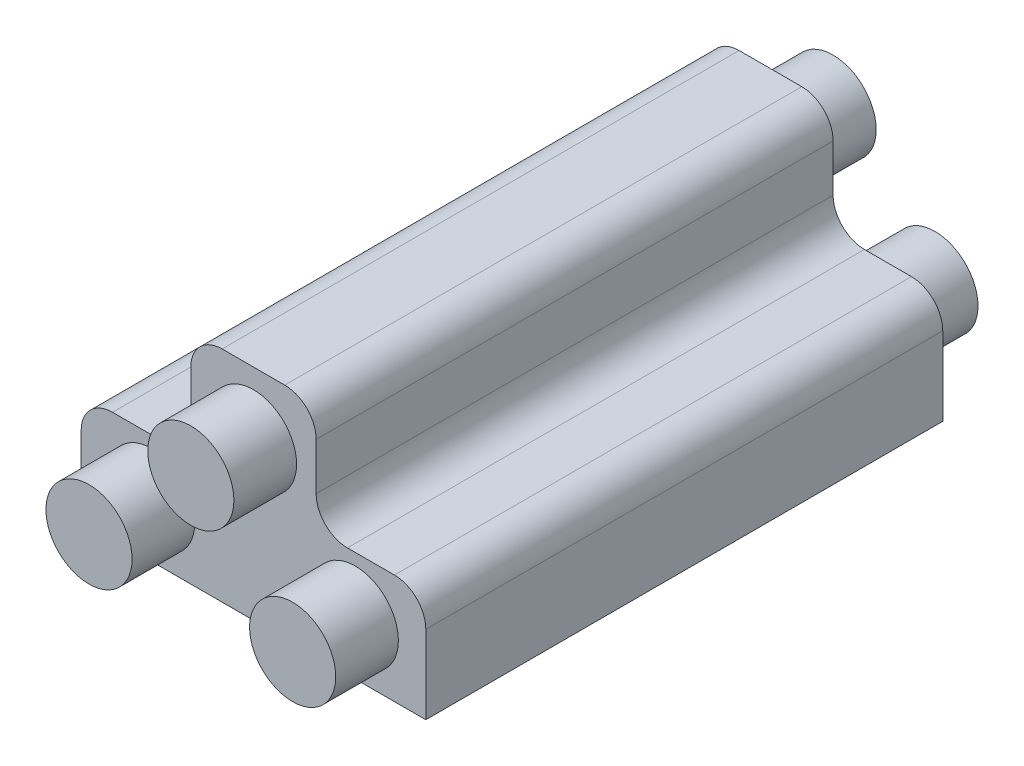
ISO-10303-21;
HEADER;
FILE_DESCRIPTION(('STEP AP214'),'2;1');
FILE_NAME('part.step','',(''),(''),'','','');
FILE_SCHEMA(('AUTOMOTIVE_DESIGN { 1 0 10303 214 1 1 1 1 }'));
ENDSEC;
DATA;
#1=APPLICATION_CONTEXT('core data for automotive mechanical design processes');
#2=APPLICATION_PROTOCOL_DEFINITION('international standard','automotive_design',2000,#1);
#3=PRODUCT_CONTEXT('',#1,'mechanical');
#4=PRODUCT('Part','Part','',(#3));
#5=PRODUCT_RELATED_PRODUCT_CATEGORY('part','',(#4));
#6=PRODUCT_DEFINITION_FORMATION('','',#4);
#7=PRODUCT_DEFINITION_CONTEXT('part definition',#1,'design');
#8=PRODUCT_DEFINITION('design','',#6,#7);
#9=PRODUCT_DEFINITION_SHAPE('','',#8);
#10=(LENGTH_UNIT() NAMED_UNIT(*) SI_UNIT(.MILLI.,.METRE.));
#11=(NAMED_UNIT(*) PLANE_ANGLE_UNIT() SI_UNIT($,.RADIAN.));
#12=(NAMED_UNIT(*) SI_UNIT($,.STERADIAN.) SOLID_ANGLE_UNIT());
#13=UNCERTAINTY_MEASURE_WITH_UNIT(LENGTH_MEASURE(1.E-05),#10,'distance_accuracy_value','');
#14=(GEOMETRIC_REPRESENTATION_CONTEXT(3) GLOBAL_UNCERTAINTY_ASSIGNED_CONTEXT((#13)) GLOBAL_UNIT_ASSIGNED_CONTEXT((#10,
#11,#12)) REPRESENTATION_CONTEXT('',''));
#15=CARTESIAN_POINT('',(0.,0.,0.));
#16=DIRECTION('',(0.,0.,1.));
#17=DIRECTION('',(1.,0.,0.));
#18=AXIS2_PLACEMENT_3D('',#15,#16,#17);
#19=CARTESIAN_POINT('',(5.5,1.75,16.5));
#20=DIRECTION('',(-1.,0.,0.));
#21=DIRECTION('',(0.,-1.,0.));
#22=AXIS2_PLACEMENT_3D('',#19,#20,#21);
#23=PLANE('',#22);
#24=DIRECTION('',(0.,1.,0.));
#25=VECTOR('',#24,1.);
#26=CARTESIAN_POINT('',(5.5,1.75,0.));
#27=LINE('',#26,#25);
#28=CARTESIAN_POINT('',(5.5,-1.75,0.));
#29=VERTEX_POINT('',#28);
#30=CARTESIAN_POINT('',(5.5,0.749999999999998,0.));
#31=VERTEX_POINT('',#30);
#32=EDGE_CURVE('E168',#29,#31,#27,.T.);
#33=ORIENTED_EDGE('',*,*,#32,.T.);
#34=DIRECTION('',(0.,0.,-1.));
#35=VECTOR('',#34,1.);
#36=CARTESIAN_POINT('',(5.5,0.749999999999998,16.5));
#37=LINE('',#36,#35);
#38=CARTESIAN_POINT('',(5.5,0.749999999999998,16.5));
#39=VERTEX_POINT('',#38);
#40=EDGE_CURVE('E215',#31,#39,#37,.F.);
#41=ORIENTED_EDGE('',*,*,#40,.T.);
#42=DIRECTION('',(0.,1.,0.));
#43=VECTOR('',#42,1.);
#44=CARTESIAN_POINT('',(5.5,1.75,16.5));
#45=LINE('',#44,#43);
#46=CARTESIAN_POINT('',(5.5,-1.75,16.5));
#47=VERTEX_POINT('',#46);
#48=EDGE_CURVE('E186',#47,#39,#45,.T.);
#49=ORIENTED_EDGE('',*,*,#48,.F.);
#50=DIRECTION('',(0.,0.,-1.));
#51=VECTOR('',#50,1.);
#52=CARTESIAN_POINT('',(5.5,-1.75,16.5));
#53=LINE('',#52,#51);
#54=EDGE_CURVE('E159',#47,#29,#53,.T.);
#55=ORIENTED_EDGE('',*,*,#54,.T.);
#56=EDGE_LOOP('',(#33,#41,#49,#55));
#57=FACE_BOUND('',#56,.T.);
#58=ADVANCED_FACE('F37',(#57),#23,.F.);
#59=CARTESIAN_POINT('',(2.,1.75,16.5));
#60=DIRECTION('',(0.,-1.,0.));
#61=DIRECTION('',(1.,0.,0.));
#62=AXIS2_PLACEMENT_3D('',#59,#60,#61);
#63=PLANE('',#62);
#64=DIRECTION('',(-1.,0.,0.));
#65=VECTOR('',#64,1.);
#66=CARTESIAN_POINT('',(2.,1.75,0.));
#67=LINE('',#66,#65);
#68=CARTESIAN_POINT('',(4.5,1.75,0.));
#69=VERTEX_POINT('',#68);
#70=CARTESIAN_POINT('',(3.,1.75,0.));
#71=VERTEX_POINT('',#70);
#72=EDGE_CURVE('E171',#69,#71,#67,.T.);
#73=ORIENTED_EDGE('',*,*,#72,.T.);
#74=DIRECTION('',(0.,0.,-1.));
#75=VECTOR('',#74,1.);
#76=CARTESIAN_POINT('',(3.,1.75,16.5));
#77=LINE('',#76,#75);
#78=CARTESIAN_POINT('',(3.,1.75,16.5));
#79=VERTEX_POINT('',#78);
#80=EDGE_CURVE('E58',#71,#79,#77,.F.);
#81=ORIENTED_EDGE('',*,*,#80,.T.);
#82=DIRECTION('',(-1.,0.,0.));
#83=VECTOR('',#82,1.);
#84=CARTESIAN_POINT('',(2.,1.75,16.5));
#85=LINE('',#84,#83);
#86=CARTESIAN_POINT('',(4.5,1.75,16.5));
#87=VERTEX_POINT('',#86);
#88=EDGE_CURVE('E292',#87,#79,#85,.T.);
#89=ORIENTED_EDGE('',*,*,#88,.F.);
#90=DIRECTION('',(0.,0.,-1.));
#91=VECTOR('',#90,1.);
#92=CARTESIAN_POINT('',(4.5,1.75,16.5));
#93=LINE('',#92,#91);
#94=EDGE_CURVE('E201',#87,#69,#93,.T.);
#95=ORIENTED_EDGE('',*,*,#94,.T.);
#96=EDGE_LOOP('',(#73,#81,#89,#95));
#97=FACE_BOUND('',#96,.T.);
#98=ADVANCED_FACE('F340',(#97),#63,.F.);
#99=CARTESIAN_POINT('',(2.,5.25,16.5));
#100=DIRECTION('',(-1.,0.,0.));
#101=DIRECTION('',(0.,-1.,0.));
#102=AXIS2_PLACEMENT_3D('',#99,#100,#101);
#103=PLANE('',#102);
#104=DIRECTION('',(0.,1.,0.));
#105=VECTOR('',#104,1.);
#106=CARTESIAN_POINT('',(2.,5.25,16.5));
#107=LINE('',#106,#105);
#108=CARTESIAN_POINT('',(2.,2.75,16.5));
#109=VERTEX_POINT('',#108);
#110=CARTESIAN_POINT('',(2.,4.25,16.5));
#111=VERTEX_POINT('',#110);
#112=EDGE_CURVE('E289',#109,#111,#107,.T.);
#113=ORIENTED_EDGE('',*,*,#112,.F.);
#114=DIRECTION('',(0.,0.,-1.));
#115=VECTOR('',#114,1.);
#116=CARTESIAN_POINT('',(2.,2.75,0.));
#117=LINE('',#116,#115);
#118=CARTESIAN_POINT('',(2.,2.75,0.));
#119=VERTEX_POINT('',#118);
#120=EDGE_CURVE('E245',#109,#119,#117,.T.);
#121=ORIENTED_EDGE('',*,*,#120,.T.);
#122=DIRECTION('',(0.,1.,0.));
#123=VECTOR('',#122,1.);
#124=CARTESIAN_POINT('',(2.,5.25,0.));
#125=LINE('',#124,#123);
#126=CARTESIAN_POINT('',(2.,4.25,0.));
#127=VERTEX_POINT('',#126);
#128=EDGE_CURVE('E174',#119,#127,#125,.T.);
#129=ORIENTED_EDGE('',*,*,#128,.T.);
#130=DIRECTION('',(0.,0.,-1.));
#131=VECTOR('',#130,1.);
#132=CARTESIAN_POINT('',(2.,4.25,16.5));
#133=LINE('',#132,#131);
#134=EDGE_CURVE('E229',#127,#111,#133,.F.);
#135=ORIENTED_EDGE('',*,*,#134,.T.);
#136=EDGE_LOOP('',(#113,#121,#129,#135));
#137=FACE_BOUND('',#136,.T.);
#138=ADVANCED_FACE('F287',(#137),#103,.F.);
#139=CARTESIAN_POINT('',(-2.,5.25,16.5));
#140=DIRECTION('',(0.,-1.,0.));
#141=DIRECTION('',(1.,0.,0.));
#142=AXIS2_PLACEMENT_3D('',#139,#140,#141);
#143=PLANE('',#142);
#144=DIRECTION('',(-1.,0.,0.));
#145=VECTOR('',#144,1.);
#146=CARTESIAN_POINT('',(-2.,5.25,16.5));
#147=LINE('',#146,#145);
#148=CARTESIAN_POINT('',(1.,5.25,16.5));
#149=VERTEX_POINT('',#148);
#150=CARTESIAN_POINT('',(-0.999999999999999,5.25,16.5));
#151=VERTEX_POINT('',#150);
#152=EDGE_CURVE('E280',#149,#151,#147,.T.);
#153=ORIENTED_EDGE('',*,*,#152,.F.);
#154=DIRECTION('',(0.,0.,-1.));
#155=VECTOR('',#154,1.);
#156=CARTESIAN_POINT('',(1.,5.25,16.5));
#157=LINE('',#156,#155);
#158=CARTESIAN_POINT('',(1.,5.25,0.));
#159=VERTEX_POINT('',#158);
#160=EDGE_CURVE('E226',#149,#159,#157,.T.);
#161=ORIENTED_EDGE('',*,*,#160,.T.);
#162=DIRECTION('',(-1.,0.,0.));
#163=VECTOR('',#162,1.);
#164=CARTESIAN_POINT('',(-2.,5.25,0.));
#165=LINE('',#164,#163);
#166=CARTESIAN_POINT('',(-0.999999999999999,5.25,0.));
#167=VERTEX_POINT('',#166);
#168=EDGE_CURVE('E176',#159,#167,#165,.T.);
#169=ORIENTED_EDGE('',*,*,#168,.T.);
#170=DIRECTION('',(0.,0.,-1.));
#171=VECTOR('',#170,1.);
#172=CARTESIAN_POINT('',(-0.999999999999999,5.25,16.5));
#173=LINE('',#172,#171);
#174=EDGE_CURVE('E224',#167,#151,#173,.F.);
#175=ORIENTED_EDGE('',*,*,#174,.T.);
#176=EDGE_LOOP('',(#153,#161,#169,#175));
#177=FACE_BOUND('',#176,.T.);
#178=ADVANCED_FACE('F277',(#177),#143,.F.);
#179=CARTESIAN_POINT('',(-2.,1.75,16.5));
#180=DIRECTION('',(1.,0.,0.));
#181=DIRECTION('',(0.,1.,0.));
#182=AXIS2_PLACEMENT_3D('',#179,#180,#181);
#183=PLANE('',#182);
#184=DIRECTION('',(0.,-1.,0.));
#185=VECTOR('',#184,1.);
#186=CARTESIAN_POINT('',(-2.,1.75,0.));
#187=LINE('',#186,#185);
#188=CARTESIAN_POINT('',(-2.,4.25,0.));
#189=VERTEX_POINT('',#188);
#190=CARTESIAN_POINT('',(-2.,2.75,0.));
#191=VERTEX_POINT('',#190);
#192=EDGE_CURVE('E179',#189,#191,#187,.T.);
#193=ORIENTED_EDGE('',*,*,#192,.T.);
#194=DIRECTION('',(0.,0.,-1.));
#195=VECTOR('',#194,1.);
#196=CARTESIAN_POINT('',(-2.,2.75,16.5));
#197=LINE('',#196,#195);
#198=CARTESIAN_POINT('',(-2.,2.75,16.5));
#199=VERTEX_POINT('',#198);
#200=EDGE_CURVE('E243',#191,#199,#197,.F.);
#201=ORIENTED_EDGE('',*,*,#200,.T.);
#202=DIRECTION('',(0.,-1.,0.));
#203=VECTOR('',#202,1.);
#204=CARTESIAN_POINT('',(-2.,1.75,16.5));
#205=LINE('',#204,#203);
#206=CARTESIAN_POINT('',(-2.,4.25,16.5));
#207=VERTEX_POINT('',#206);
#208=EDGE_CURVE('E256',#207,#199,#205,.T.);
#209=ORIENTED_EDGE('',*,*,#208,.F.);
#210=DIRECTION('',(0.,0.,-1.));
#211=VECTOR('',#210,1.);
#212=CARTESIAN_POINT('',(-2.,4.25,16.5));
#213=LINE('',#212,#211);
#214=EDGE_CURVE('E232',#207,#189,#213,.T.);
#215=ORIENTED_EDGE('',*,*,#214,.T.);
#216=EDGE_LOOP('',(#193,#201,#209,#215));
#217=FACE_BOUND('',#216,.T.);
#218=ADVANCED_FACE('F268',(#217),#183,.F.);
#219=CARTESIAN_POINT('',(-5.5,1.75,16.5));
#220=DIRECTION('',(0.,-1.,0.));
#221=DIRECTION('',(1.,0.,0.));
#222=AXIS2_PLACEMENT_3D('',#219,#220,#221);
#223=PLANE('',#222);
#224=DIRECTION('',(-1.,0.,0.));
#225=VECTOR('',#224,1.);
#226=CARTESIAN_POINT('',(-5.5,1.75,16.5));
#227=LINE('',#226,#225);
#228=CARTESIAN_POINT('',(-3.,1.75,16.5));
#229=VERTEX_POINT('',#228);
#230=CARTESIAN_POINT('',(-4.5,1.75,16.5));
#231=VERTEX_POINT('',#230);
#232=EDGE_CURVE('E149',#229,#231,#227,.T.);
#233=ORIENTED_EDGE('',*,*,#232,.F.);
#234=DIRECTION('',(0.,0.,-1.));
#235=VECTOR('',#234,1.);
#236=CARTESIAN_POINT('',(-3.,1.75,0.));
#237=LINE('',#236,#235);
#238=CARTESIAN_POINT('',(-3.,1.75,0.));
#239=VERTEX_POINT('',#238);
#240=EDGE_CURVE('E240',#229,#239,#237,.T.);
#241=ORIENTED_EDGE('',*,*,#240,.T.);
#242=DIRECTION('',(-1.,0.,0.));
#243=VECTOR('',#242,1.);
#244=CARTESIAN_POINT('',(-5.5,1.75,0.));
#245=LINE('',#244,#243);
#246=CARTESIAN_POINT('',(-4.5,1.75,0.));
#247=VERTEX_POINT('',#246);
#248=EDGE_CURVE('E182',#239,#247,#245,.T.);
#249=ORIENTED_EDGE('',*,*,#248,.T.);
#250=DIRECTION('',(0.,0.,-1.));
#251=VECTOR('',#250,1.);
#252=CARTESIAN_POINT('',(-4.5,1.75,16.5));
#253=LINE('',#252,#251);
#254=EDGE_CURVE('E237',#247,#231,#253,.F.);
#255=ORIENTED_EDGE('',*,*,#254,.T.);
#256=EDGE_LOOP('',(#233,#241,#249,#255));
#257=FACE_BOUND('',#256,.T.);
#258=ADVANCED_FACE('F261',(#257),#223,.F.);
#259=CARTESIAN_POINT('',(-5.5,1.75,16.5));
#260=DIRECTION('',(1.,0.,0.));
#261=DIRECTION('',(0.,1.,0.));
#262=AXIS2_PLACEMENT_3D('',#259,#260,#261);
#263=PLANE('',#262);
#264=DIRECTION('',(0.,-1.,0.));
#265=VECTOR('',#264,1.);
#266=CARTESIAN_POINT('',(-5.5,1.75,16.5));
#267=LINE('',#266,#265);
#268=CARTESIAN_POINT('',(-5.5,0.75,16.5));
#269=VERTEX_POINT('',#268);
#270=CARTESIAN_POINT('',(-5.5,-1.75,16.5));
#271=VERTEX_POINT('',#270);
#272=EDGE_CURVE('E137',#269,#271,#267,.T.);
#273=ORIENTED_EDGE('',*,*,#272,.F.);
#274=DIRECTION('',(0.,0.,-1.));
#275=VECTOR('',#274,1.);
#276=CARTESIAN_POINT('',(-5.5,0.75,16.5));
#277=LINE('',#276,#275);
#278=CARTESIAN_POINT('',(-5.5,0.75,0.));
#279=VERTEX_POINT('',#278);
#280=EDGE_CURVE('E235',#269,#279,#277,.T.);
#281=ORIENTED_EDGE('',*,*,#280,.T.);
#282=DIRECTION('',(0.,-1.,0.));
#283=VECTOR('',#282,1.);
#284=CARTESIAN_POINT('',(-5.5,1.75,0.));
#285=LINE('',#284,#283);
#286=CARTESIAN_POINT('',(-5.5,-1.75,0.));
#287=VERTEX_POINT('',#286);
#288=EDGE_CURVE('E155',#279,#287,#285,.T.);
#289=ORIENTED_EDGE('',*,*,#288,.T.);
#290=DIRECTION('',(0.,0.,-1.));
#291=VECTOR('',#290,1.);
#292=CARTESIAN_POINT('',(-5.5,-1.75,16.5));
#293=LINE('',#292,#291);
#294=EDGE_CURVE('E152',#271,#287,#293,.T.);
#295=ORIENTED_EDGE('',*,*,#294,.F.);
#296=EDGE_LOOP('',(#273,#281,#289,#295));
#297=FACE_BOUND('',#296,.T.);
#298=ADVANCED_FACE('F153',(#297),#263,.F.);
#299=CARTESIAN_POINT('',(-5.5,-1.75,16.5));
#300=DIRECTION('',(0.,1.,0.));
#301=DIRECTION('',(-1.,0.,0.));
#302=AXIS2_PLACEMENT_3D('',#299,#300,#301);
#303=PLANE('',#302);
#304=DIRECTION('',(1.,0.,0.));
#305=VECTOR('',#304,1.);
#306=CARTESIAN_POINT('',(-5.5,-1.75,0.));
#307=LINE('',#306,#305);
#308=EDGE_CURVE('E185',#287,#29,#307,.T.);
#309=ORIENTED_EDGE('',*,*,#308,.T.);
#310=ORIENTED_EDGE('',*,*,#54,.F.);
#311=DIRECTION('',(1.,0.,0.));
#312=VECTOR('',#311,1.);
#313=CARTESIAN_POINT('',(-5.5,-1.75,16.5));
#314=LINE('',#313,#312);
#315=EDGE_CURVE('E142',#271,#47,#314,.T.);
#316=ORIENTED_EDGE('',*,*,#315,.F.);
#317=ORIENTED_EDGE('',*,*,#294,.T.);
#318=EDGE_LOOP('',(#309,#310,#316,#317));
#319=FACE_BOUND('',#318,.T.);
#320=ADVANCED_FACE('F161',(#319),#303,.F.);
#321=CARTESIAN_POINT('',(0.,0.,16.5));
#322=DIRECTION('',(0.,0.,1.));
#323=DIRECTION('',(1.,0.,0.));
#324=AXIS2_PLACEMENT_3D('',#321,#322,#323);
#325=PLANE('',#324);
#326=CARTESIAN_POINT('',(3.25,0.,16.5));
#327=DIRECTION('',(0.,0.,1.));
#328=DIRECTION('',(1.,0.,0.));
#329=AXIS2_PLACEMENT_3D('',#326,#327,#328);
#330=CIRCLE('',#329,1.375);
#331=CARTESIAN_POINT('',(4.625,0.,16.5));
#332=VERTEX_POINT('',#331);
#333=EDGE_CURVE('E205',#332,#332,#330,.T.);
#334=ORIENTED_EDGE('',*,*,#333,.F.);
#335=EDGE_LOOP('',(#334));
#336=FACE_BOUND('',#335,.T.);
#337=CARTESIAN_POINT('',(-3.25,0.,16.5));
#338=DIRECTION('',(0.,0.,1.));
#339=DIRECTION('',(1.,0.,0.));
#340=AXIS2_PLACEMENT_3D('',#337,#338,#339);
#341=CIRCLE('',#340,1.375);
#342=CARTESIAN_POINT('',(-1.875,0.,16.5));
#343=VERTEX_POINT('',#342);
#344=EDGE_CURVE('E303',#343,#343,#341,.T.);
#345=ORIENTED_EDGE('',*,*,#344,.F.);
#346=EDGE_LOOP('',(#345));
#347=FACE_BOUND('',#346,.T.);
#348=CARTESIAN_POINT('',(0.,3.25,16.5));
#349=DIRECTION('',(0.,0.,1.));
#350=DIRECTION('',(1.,0.,0.));
#351=AXIS2_PLACEMENT_3D('',#348,#349,#350);
#352=CIRCLE('',#351,1.375);
#353=CARTESIAN_POINT('',(1.375,3.25,16.5));
#354=VERTEX_POINT('',#353);
#355=EDGE_CURVE('E158',#354,#354,#352,.T.);
#356=ORIENTED_EDGE('',*,*,#355,.F.);
#357=EDGE_LOOP('',(#356));
#358=FACE_BOUND('',#357,.T.);
#359=ORIENTED_EDGE('',*,*,#48,.T.);
#360=CARTESIAN_POINT('',(4.5,0.749999999999998,16.5));
#361=DIRECTION('',(0.,0.,1.));
#362=DIRECTION('',(1.,0.,0.));
#363=AXIS2_PLACEMENT_3D('',#360,#361,#362);
#364=CIRCLE('',#363,1.);
#365=EDGE_CURVE('E222',#39,#87,#364,.T.);
#366=ORIENTED_EDGE('',*,*,#365,.T.);
#367=ORIENTED_EDGE('',*,*,#88,.T.);
#368=CARTESIAN_POINT('',(3.,2.75,16.5));
#369=DIRECTION('',(0.,0.,1.));
#370=DIRECTION('',(1.,0.,0.));
#371=AXIS2_PLACEMENT_3D('',#368,#369,#370);
#372=CIRCLE('',#371,1.);
#373=EDGE_CURVE('E11',#79,#109,#372,.F.);
#374=ORIENTED_EDGE('',*,*,#373,.T.);
#375=ORIENTED_EDGE('',*,*,#112,.T.);
#376=CARTESIAN_POINT('',(1.,4.25,16.5));
#377=DIRECTION('',(0.,0.,1.));
#378=DIRECTION('',(1.,0.,0.));
#379=AXIS2_PLACEMENT_3D('',#376,#377,#378);
#380=CIRCLE('',#379,1.);
#381=EDGE_CURVE('E220',#111,#149,#380,.T.);
#382=ORIENTED_EDGE('',*,*,#381,.T.);
#383=ORIENTED_EDGE('',*,*,#152,.T.);
#384=CARTESIAN_POINT('',(-0.999999999999999,4.25,16.5));
#385=DIRECTION('',(0.,0.,1.));
#386=DIRECTION('',(1.,0.,0.));
#387=AXIS2_PLACEMENT_3D('',#384,#385,#386);
#388=CIRCLE('',#387,1.);
#389=EDGE_CURVE('E218',#151,#207,#388,.T.);
#390=ORIENTED_EDGE('',*,*,#389,.T.);
#391=ORIENTED_EDGE('',*,*,#208,.T.);
#392=CARTESIAN_POINT('',(-3.,2.75,16.5));
#393=DIRECTION('',(0.,0.,1.));
#394=DIRECTION('',(1.,0.,0.));
#395=AXIS2_PLACEMENT_3D('',#392,#393,#394);
#396=CIRCLE('',#395,1.);
#397=EDGE_CURVE('E251',#199,#229,#396,.F.);
#398=ORIENTED_EDGE('',*,*,#397,.T.);
#399=ORIENTED_EDGE('',*,*,#232,.T.);
#400=CARTESIAN_POINT('',(-4.5,0.75,16.5));
#401=DIRECTION('',(0.,0.,1.));
#402=DIRECTION('',(1.,0.,0.));
#403=AXIS2_PLACEMENT_3D('',#400,#401,#402);
#404=CIRCLE('',#403,1.);
#405=EDGE_CURVE('E145',#231,#269,#404,.T.);
#406=ORIENTED_EDGE('',*,*,#405,.T.);
#407=ORIENTED_EDGE('',*,*,#272,.T.);
#408=ORIENTED_EDGE('',*,*,#315,.T.);
#409=EDGE_LOOP('',(#359,#366,#367,#374,#375,#382,#383,#390,#391,#398,#399,#406,#407,#408));
#410=FACE_BOUND('',#409,.T.);
#411=ADVANCED_FACE('F140',(#336,#347,#358,#410),#325,.T.);
#412=CARTESIAN_POINT('',(0.,0.,0.));
#413=DIRECTION('',(0.,0.,1.));
#414=DIRECTION('',(1.,0.,0.));
#415=AXIS2_PLACEMENT_3D('',#412,#413,#414);
#416=PLANE('',#415);
#417=CARTESIAN_POINT('',(3.25,0.,0.));
#418=DIRECTION('',(0.,0.,1.));
#419=DIRECTION('',(1.,0.,0.));
#420=AXIS2_PLACEMENT_3D('',#417,#418,#419);
#421=CIRCLE('',#420,1.375);
#422=CARTESIAN_POINT('',(4.625,0.,0.));
#423=VERTEX_POINT('',#422);
#424=EDGE_CURVE('E196',#423,#423,#421,.T.);
#425=ORIENTED_EDGE('',*,*,#424,.T.);
#426=EDGE_LOOP('',(#425));
#427=FACE_BOUND('',#426,.T.);
#428=CARTESIAN_POINT('',(-3.25,0.,0.));
#429=DIRECTION('',(0.,0.,1.));
#430=DIRECTION('',(1.,0.,0.));
#431=AXIS2_PLACEMENT_3D('',#428,#429,#430);
#432=CIRCLE('',#431,1.375);
#433=CARTESIAN_POINT('',(-1.875,0.,0.));
#434=VERTEX_POINT('',#433);
#435=EDGE_CURVE('E191',#434,#434,#432,.T.);
#436=ORIENTED_EDGE('',*,*,#435,.T.);
#437=EDGE_LOOP('',(#436));
#438=FACE_BOUND('',#437,.T.);
#439=CARTESIAN_POINT('',(0.,3.25,0.));
#440=DIRECTION('',(0.,0.,1.));
#441=DIRECTION('',(1.,0.,0.));
#442=AXIS2_PLACEMENT_3D('',#439,#440,#441);
#443=CIRCLE('',#442,1.375);
#444=CARTESIAN_POINT('',(1.375,3.25,0.));
#445=VERTEX_POINT('',#444);
#446=EDGE_CURVE('E172',#445,#445,#443,.T.);
#447=ORIENTED_EDGE('',*,*,#446,.T.);
#448=EDGE_LOOP('',(#447));
#449=FACE_BOUND('',#448,.T.);
#450=ORIENTED_EDGE('',*,*,#72,.F.);
#451=CARTESIAN_POINT('',(4.5,0.749999999999998,0.));
#452=DIRECTION('',(0.,0.,1.));
#453=DIRECTION('',(1.,0.,0.));
#454=AXIS2_PLACEMENT_3D('',#451,#452,#453);
#455=CIRCLE('',#454,1.);
#456=EDGE_CURVE('E213',#69,#31,#455,.F.);
#457=ORIENTED_EDGE('',*,*,#456,.T.);
#458=ORIENTED_EDGE('',*,*,#32,.F.);
#459=ORIENTED_EDGE('',*,*,#308,.F.);
#460=ORIENTED_EDGE('',*,*,#288,.F.);
#461=CARTESIAN_POINT('',(-4.5,0.75,0.));
#462=DIRECTION('',(0.,0.,1.));
#463=DIRECTION('',(1.,0.,0.));
#464=AXIS2_PLACEMENT_3D('',#461,#462,#463);
#465=CIRCLE('',#464,1.);
#466=EDGE_CURVE('E204',#279,#247,#465,.F.);
#467=ORIENTED_EDGE('',*,*,#466,.T.);
#468=ORIENTED_EDGE('',*,*,#248,.F.);
#469=CARTESIAN_POINT('',(-3.,2.75,0.));
#470=DIRECTION('',(0.,0.,1.));
#471=DIRECTION('',(1.,0.,0.));
#472=AXIS2_PLACEMENT_3D('',#469,#470,#471);
#473=CIRCLE('',#472,1.);
#474=EDGE_CURVE('E249',#239,#191,#473,.T.);
#475=ORIENTED_EDGE('',*,*,#474,.T.);
#476=ORIENTED_EDGE('',*,*,#192,.F.);
#477=CARTESIAN_POINT('',(-0.999999999999999,4.25,0.));
#478=DIRECTION('',(0.,0.,1.));
#479=DIRECTION('',(1.,0.,0.));
#480=AXIS2_PLACEMENT_3D('',#477,#478,#479);
#481=CIRCLE('',#480,1.);
#482=EDGE_CURVE('E208',#189,#167,#481,.F.);
#483=ORIENTED_EDGE('',*,*,#482,.T.);
#484=ORIENTED_EDGE('',*,*,#168,.F.);
#485=CARTESIAN_POINT('',(1.,4.25,0.));
#486=DIRECTION('',(0.,0.,1.));
#487=DIRECTION('',(1.,0.,0.));
#488=AXIS2_PLACEMENT_3D('',#485,#486,#487);
#489=CIRCLE('',#488,1.);
#490=EDGE_CURVE('E210',#159,#127,#489,.F.);
#491=ORIENTED_EDGE('',*,*,#490,.T.);
#492=ORIENTED_EDGE('',*,*,#128,.F.);
#493=CARTESIAN_POINT('',(3.,2.75,0.));
#494=DIRECTION('',(0.,0.,1.));
#495=DIRECTION('',(1.,0.,0.));
#496=AXIS2_PLACEMENT_3D('',#493,#494,#495);
#497=CIRCLE('',#496,1.);
#498=EDGE_CURVE('E45',#119,#71,#497,.T.);
#499=ORIENTED_EDGE('',*,*,#498,.T.);
#500=EDGE_LOOP('',(#450,#457,#458,#459,#460,#467,#468,#475,#476,#483,#484,#491,#492,#499));
#501=FACE_BOUND('',#500,.T.);
#502=ADVANCED_FACE('F266',(#427,#438,#449,#501),#416,.F.);
#503=CARTESIAN_POINT('',(0.,3.25,-1.99999999999999));
#504=DIRECTION('',(0.,0.,1.));
#505=DIRECTION('',(1.,0.,0.));
#506=AXIS2_PLACEMENT_3D('',#503,#504,#505);
#507=PLANE('',#506);
#508=CARTESIAN_POINT('',(0.,3.25,-1.99999999999999));
#509=DIRECTION('',(0.,0.,1.));
#510=DIRECTION('',(1.,0.,0.));
#511=AXIS2_PLACEMENT_3D('',#508,#509,#510);
#512=CIRCLE('',#511,1.375);
#513=CARTESIAN_POINT('',(1.375,3.25,-1.99999999999999));
#514=VERTEX_POINT('',#513);
#515=EDGE_CURVE('E190',#514,#514,#512,.T.);
#516=ORIENTED_EDGE('',*,*,#515,.F.);
#517=EDGE_LOOP('',(#516));
#518=FACE_BOUND('',#517,.T.);
#519=ADVANCED_FACE('F380',(#518),#507,.F.);
#520=CARTESIAN_POINT('',(0.,3.25,-1.99999999999999));
#521=DIRECTION('',(0.,0.,1.));
#522=DIRECTION('',(1.,0.,0.));
#523=AXIS2_PLACEMENT_3D('',#520,#521,#522);
#524=CYLINDRICAL_SURFACE('',#523,1.375);
#525=ORIENTED_EDGE('',*,*,#515,.T.);
#526=EDGE_LOOP('',(#525));
#527=FACE_BOUND('',#526,.T.);
#528=ORIENTED_EDGE('',*,*,#446,.F.);
#529=EDGE_LOOP('',(#528));
#530=FACE_BOUND('',#529,.T.);
#531=ADVANCED_FACE('F474',(#527,#530),#524,.T.);
#532=ORIENTED_EDGE('',*,*,#355,.T.);
#533=EDGE_LOOP('',(#532));
#534=FACE_BOUND('',#533,.T.);
#535=CARTESIAN_POINT('',(0.,3.25,18.5));
#536=DIRECTION('',(0.,0.,1.));
#537=DIRECTION('',(1.,0.,0.));
#538=AXIS2_PLACEMENT_3D('',#535,#536,#537);
#539=CIRCLE('',#538,1.375);
#540=CARTESIAN_POINT('',(1.375,3.25,18.5));
#541=VERTEX_POINT('',#540);
#542=EDGE_CURVE('E194',#541,#541,#539,.T.);
#543=ORIENTED_EDGE('',*,*,#542,.F.);
#544=EDGE_LOOP('',(#543));
#545=FACE_BOUND('',#544,.T.);
#546=ADVANCED_FACE('F483',(#534,#545),#524,.T.);
#547=CARTESIAN_POINT('',(0.,3.25,18.5));
#548=DIRECTION('',(0.,0.,1.));
#549=DIRECTION('',(1.,0.,0.));
#550=AXIS2_PLACEMENT_3D('',#547,#548,#549);
#551=PLANE('',#550);
#552=ORIENTED_EDGE('',*,*,#542,.T.);
#553=EDGE_LOOP('',(#552));
#554=FACE_BOUND('',#553,.T.);
#555=ADVANCED_FACE('F492',(#554),#551,.T.);
#556=CARTESIAN_POINT('',(-3.25,0.,-1.99999999999999));
#557=DIRECTION('',(0.,0.,1.));
#558=DIRECTION('',(1.,0.,0.));
#559=AXIS2_PLACEMENT_3D('',#556,#557,#558);
#560=PLANE('',#559);
#561=CARTESIAN_POINT('',(-3.25,0.,-1.99999999999999));
#562=DIRECTION('',(0.,0.,1.));
#563=DIRECTION('',(1.,0.,0.));
#564=AXIS2_PLACEMENT_3D('',#561,#562,#563);
#565=CIRCLE('',#564,1.375);
#566=CARTESIAN_POINT('',(-1.875,0.,-1.99999999999999));
#567=VERTEX_POINT('',#566);
#568=EDGE_CURVE('E195',#567,#567,#565,.T.);
#569=ORIENTED_EDGE('',*,*,#568,.F.);
#570=EDGE_LOOP('',(#569));
#571=FACE_BOUND('',#570,.T.);
#572=ADVANCED_FACE('F500',(#571),#560,.F.);
#573=CARTESIAN_POINT('',(-3.25,0.,-1.99999999999999));
#574=DIRECTION('',(0.,0.,1.));
#575=DIRECTION('',(1.,0.,0.));
#576=AXIS2_PLACEMENT_3D('',#573,#574,#575);
#577=CYLINDRICAL_SURFACE('',#576,1.375);
#578=ORIENTED_EDGE('',*,*,#568,.T.);
#579=EDGE_LOOP('',(#578));
#580=FACE_BOUND('',#579,.T.);
#581=ORIENTED_EDGE('',*,*,#435,.F.);
#582=EDGE_LOOP('',(#581));
#583=FACE_BOUND('',#582,.T.);
#584=ADVANCED_FACE('F509',(#580,#583),#577,.T.);
#585=ORIENTED_EDGE('',*,*,#344,.T.);
#586=EDGE_LOOP('',(#585));
#587=FACE_BOUND('',#586,.T.);
#588=CARTESIAN_POINT('',(-3.25,0.,18.5));
#589=DIRECTION('',(0.,0.,1.));
#590=DIRECTION('',(1.,0.,0.));
#591=AXIS2_PLACEMENT_3D('',#588,#589,#590);
#592=CIRCLE('',#591,1.375);
#593=CARTESIAN_POINT('',(-1.875,0.,18.5));
#594=VERTEX_POINT('',#593);
#595=EDGE_CURVE('E199',#594,#594,#592,.T.);
#596=ORIENTED_EDGE('',*,*,#595,.F.);
#597=EDGE_LOOP('',(#596));
#598=FACE_BOUND('',#597,.T.);
#599=ADVANCED_FACE('F518',(#587,#598),#577,.T.);
#600=CARTESIAN_POINT('',(-3.25,0.,18.5));
#601=DIRECTION('',(0.,0.,1.));
#602=DIRECTION('',(1.,0.,0.));
#603=AXIS2_PLACEMENT_3D('',#600,#601,#602);
#604=PLANE('',#603);
#605=ORIENTED_EDGE('',*,*,#595,.T.);
#606=EDGE_LOOP('',(#605));
#607=FACE_BOUND('',#606,.T.);
#608=ADVANCED_FACE('F527',(#607),#604,.T.);
#609=CARTESIAN_POINT('',(3.25,0.,-1.99999999999999));
#610=DIRECTION('',(0.,0.,-1.));
#611=DIRECTION('',(-1.,0.,0.));
#612=AXIS2_PLACEMENT_3D('',#609,#610,#611);
#613=PLANE('',#612);
#614=CARTESIAN_POINT('',(3.25,0.,-1.99999999999999));
#615=DIRECTION('',(0.,0.,1.));
#616=DIRECTION('',(-1.,0.,0.));
#617=AXIS2_PLACEMENT_3D('',#614,#615,#616);
#618=CIRCLE('',#617,1.375);
#619=CARTESIAN_POINT('',(1.875,0.,-1.99999999999999));
#620=VERTEX_POINT('',#619);
#621=EDGE_CURVE('E200',#620,#620,#618,.T.);
#622=ORIENTED_EDGE('',*,*,#621,.F.);
#623=EDGE_LOOP('',(#622));
#624=FACE_BOUND('',#623,.T.);
#625=ADVANCED_FACE('F335',(#624),#613,.T.);
#626=CARTESIAN_POINT('',(3.25,0.,-1.99999999999999));
#627=DIRECTION('',(0.,0.,1.));
#628=DIRECTION('',(1.,0.,0.));
#629=AXIS2_PLACEMENT_3D('',#626,#627,#628);
#630=CYLINDRICAL_SURFACE('',#629,1.375);
#631=ORIENTED_EDGE('',*,*,#621,.T.);
#632=EDGE_LOOP('',(#631));
#633=FACE_BOUND('',#632,.T.);
#634=ORIENTED_EDGE('',*,*,#424,.F.);
#635=EDGE_LOOP('',(#634));
#636=FACE_BOUND('',#635,.T.);
#637=ADVANCED_FACE('F326',(#633,#636),#630,.T.);
#638=ORIENTED_EDGE('',*,*,#333,.T.);
#639=EDGE_LOOP('',(#638));
#640=FACE_BOUND('',#639,.T.);
#641=CARTESIAN_POINT('',(3.25,0.,18.5));
#642=DIRECTION('',(0.,0.,1.));
#643=DIRECTION('',(-1.,0.,0.));
#644=AXIS2_PLACEMENT_3D('',#641,#642,#643);
#645=CIRCLE('',#644,1.375);
#646=CARTESIAN_POINT('',(1.875,0.,18.5));
#647=VERTEX_POINT('',#646);
#648=EDGE_CURVE('E318',#647,#647,#645,.T.);
#649=ORIENTED_EDGE('',*,*,#648,.F.);
#650=EDGE_LOOP('',(#649));
#651=FACE_BOUND('',#650,.T.);
#652=ADVANCED_FACE('F324',(#640,#651),#630,.T.);
#653=CARTESIAN_POINT('',(3.25,0.,18.5));
#654=DIRECTION('',(0.,0.,-1.));
#655=DIRECTION('',(-1.,0.,0.));
#656=AXIS2_PLACEMENT_3D('',#653,#654,#655);
#657=PLANE('',#656);
#658=ORIENTED_EDGE('',*,*,#648,.T.);
#659=EDGE_LOOP('',(#658));
#660=FACE_BOUND('',#659,.T.);
#661=ADVANCED_FACE('F322',(#660),#657,.F.);
#662=CARTESIAN_POINT('',(4.5,0.749999999999998,16.5));
#663=DIRECTION('',(0.,0.,-1.));
#664=DIRECTION('',(-1.,0.,0.));
#665=AXIS2_PLACEMENT_3D('',#662,#663,#664);
#666=CYLINDRICAL_SURFACE('',#665,1.);
#667=ORIENTED_EDGE('',*,*,#365,.F.);
#668=ORIENTED_EDGE('',*,*,#40,.F.);
#669=ORIENTED_EDGE('',*,*,#456,.F.);
#670=ORIENTED_EDGE('',*,*,#94,.F.);
#671=EDGE_LOOP('',(#667,#668,#669,#670));
#672=FACE_BOUND('',#671,.T.);
#673=ADVANCED_FACE('F333',(#672),#666,.T.);
#674=CARTESIAN_POINT('',(1.,4.25,16.5));
#675=DIRECTION('',(0.,0.,-1.));
#676=DIRECTION('',(-1.,0.,0.));
#677=AXIS2_PLACEMENT_3D('',#674,#675,#676);
#678=CYLINDRICAL_SURFACE('',#677,1.);
#679=ORIENTED_EDGE('',*,*,#381,.F.);
#680=ORIENTED_EDGE('',*,*,#134,.F.);
#681=ORIENTED_EDGE('',*,*,#490,.F.);
#682=ORIENTED_EDGE('',*,*,#160,.F.);
#683=EDGE_LOOP('',(#679,#680,#681,#682));
#684=FACE_BOUND('',#683,.T.);
#685=ADVANCED_FACE('F283',(#684),#678,.T.);
#686=CARTESIAN_POINT('',(-0.999999999999999,4.25,16.5));
#687=DIRECTION('',(0.,0.,-1.));
#688=DIRECTION('',(-1.,0.,0.));
#689=AXIS2_PLACEMENT_3D('',#686,#687,#688);
#690=CYLINDRICAL_SURFACE('',#689,1.);
#691=ORIENTED_EDGE('',*,*,#389,.F.);
#692=ORIENTED_EDGE('',*,*,#174,.F.);
#693=ORIENTED_EDGE('',*,*,#482,.F.);
#694=ORIENTED_EDGE('',*,*,#214,.F.);
#695=EDGE_LOOP('',(#691,#692,#693,#694));
#696=FACE_BOUND('',#695,.T.);
#697=ADVANCED_FACE('F272',(#696),#690,.T.);
#698=CARTESIAN_POINT('',(-4.5,0.75,16.5));
#699=DIRECTION('',(0.,0.,-1.));
#700=DIRECTION('',(-1.,0.,0.));
#701=AXIS2_PLACEMENT_3D('',#698,#699,#700);
#702=CYLINDRICAL_SURFACE('',#701,1.);
#703=ORIENTED_EDGE('',*,*,#405,.F.);
#704=ORIENTED_EDGE('',*,*,#254,.F.);
#705=ORIENTED_EDGE('',*,*,#466,.F.);
#706=ORIENTED_EDGE('',*,*,#280,.F.);
#707=EDGE_LOOP('',(#703,#704,#705,#706));
#708=FACE_BOUND('',#707,.T.);
#709=ADVANCED_FACE('F358',(#708),#702,.T.);
#710=CARTESIAN_POINT('',(-3.,2.75,16.5));
#711=DIRECTION('',(0.,0.,1.));
#712=DIRECTION('',(1.,0.,0.));
#713=AXIS2_PLACEMENT_3D('',#710,#711,#712);
#714=CYLINDRICAL_SURFACE('',#713,1.);
#715=ORIENTED_EDGE('',*,*,#397,.F.);
#716=ORIENTED_EDGE('',*,*,#200,.F.);
#717=ORIENTED_EDGE('',*,*,#474,.F.);
#718=ORIENTED_EDGE('',*,*,#240,.F.);
#719=EDGE_LOOP('',(#715,#716,#717,#718));
#720=FACE_BOUND('',#719,.T.);
#721=ADVANCED_FACE('F264',(#720),#714,.F.);
#722=CARTESIAN_POINT('',(3.,2.75,16.5));
#723=DIRECTION('',(0.,0.,1.));
#724=DIRECTION('',(1.,0.,0.));
#725=AXIS2_PLACEMENT_3D('',#722,#723,#724);
#726=CYLINDRICAL_SURFACE('',#725,1.);
#727=ORIENTED_EDGE('',*,*,#373,.F.);
#728=ORIENTED_EDGE('',*,*,#80,.F.);
#729=ORIENTED_EDGE('',*,*,#498,.F.);
#730=ORIENTED_EDGE('',*,*,#120,.F.);
#731=EDGE_LOOP('',(#727,#728,#729,#730));
#732=FACE_BOUND('',#731,.T.);
#733=ADVANCED_FACE('F39',(#732),#726,.F.);
#734=CLOSED_SHELL('',(#58,#98,#138,#178,#218,#258,#298,#320,#411,#502,#519,#531,#546,#555,#572,
#584,#599,#608,#625,#637,#652,#661,#673,#685,#697,#709,#721,#733));
#735=MANIFOLD_SOLID_BREP('B2',#734);
#736=ADVANCED_BREP_SHAPE_REPRESENTATION('',(#18,#735),#14);
#737=SHAPE_DEFINITION_REPRESENTATION(#9,#736);
ENDSEC;
END-ISO-10303-21;
